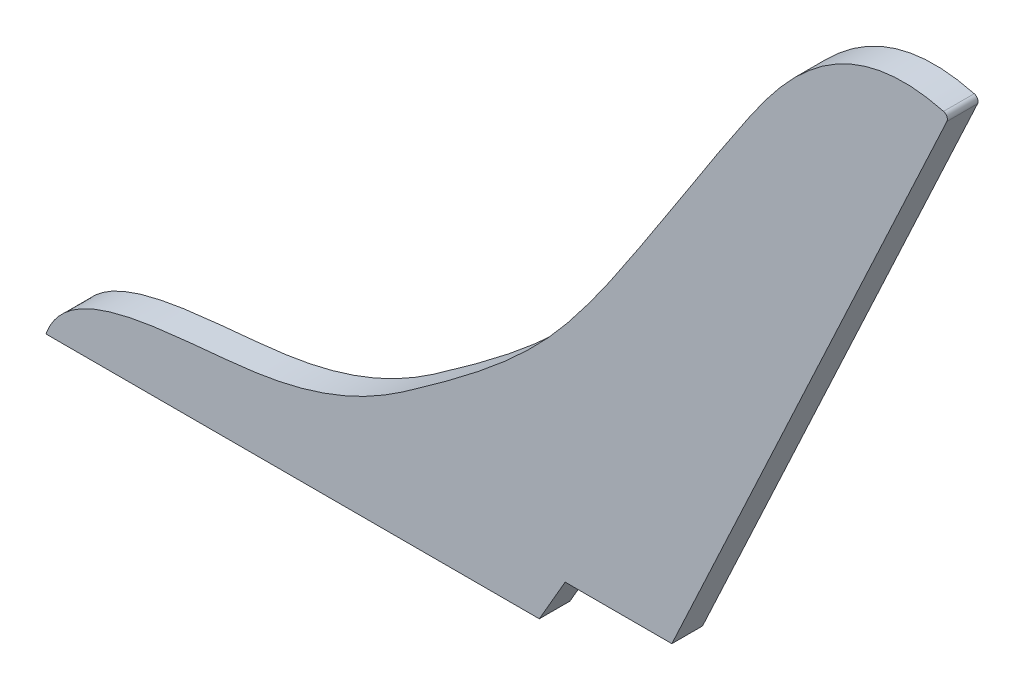
ISO-10303-21;
HEADER;
FILE_DESCRIPTION(('STEP AP214'),'2;1');
FILE_NAME('part.step','',(''),(''),'','','');
FILE_SCHEMA(('AUTOMOTIVE_DESIGN { 1 0 10303 214 1 1 1 1 }'));
ENDSEC;
DATA;
#1=APPLICATION_CONTEXT('core data for automotive mechanical design processes');
#2=APPLICATION_PROTOCOL_DEFINITION('international standard','automotive_design',2000,#1);
#3=PRODUCT_CONTEXT('',#1,'mechanical');
#4=PRODUCT('Part','Part','',(#3));
#5=PRODUCT_RELATED_PRODUCT_CATEGORY('part','',(#4));
#6=PRODUCT_DEFINITION_FORMATION('','',#4);
#7=PRODUCT_DEFINITION_CONTEXT('part definition',#1,'design');
#8=PRODUCT_DEFINITION('design','',#6,#7);
#9=PRODUCT_DEFINITION_SHAPE('','',#8);
#10=(LENGTH_UNIT() NAMED_UNIT(*) SI_UNIT(.MILLI.,.METRE.));
#11=(NAMED_UNIT(*) PLANE_ANGLE_UNIT() SI_UNIT($,.RADIAN.));
#12=(NAMED_UNIT(*) SI_UNIT($,.STERADIAN.) SOLID_ANGLE_UNIT());
#13=UNCERTAINTY_MEASURE_WITH_UNIT(LENGTH_MEASURE(1.E-05),#10,'distance_accuracy_value','');
#14=(GEOMETRIC_REPRESENTATION_CONTEXT(3) GLOBAL_UNCERTAINTY_ASSIGNED_CONTEXT((#13)) GLOBAL_UNIT_ASSIGNED_CONTEXT((#10,
#11,#12)) REPRESENTATION_CONTEXT('',''));
#15=CARTESIAN_POINT('',(0.,0.,0.));
#16=DIRECTION('',(0.,0.,1.));
#17=DIRECTION('',(1.,0.,0.));
#18=AXIS2_PLACEMENT_3D('',#15,#16,#17);
#19=CARTESIAN_POINT('',(4493.36101062911,3182.874,152.4));
#20=CARTESIAN_POINT('',(3948.74780498071,3347.08871829362,152.4));
#21=CARTESIAN_POINT('',(3278.55502622221,2366.31784345516,152.4));
#22=CARTESIAN_POINT('',(3207.90447721529,2236.56738436679,152.4));
#23=CARTESIAN_POINT('',(2889.33328263763,1753.36927298413,152.4));
#24=CARTESIAN_POINT('',(2745.92431891337,1535.79239461075,152.4));
#25=CARTESIAN_POINT('',(2399.47642415647,1097.38893033044,152.4));
#26=CARTESIAN_POINT('',(2074.66626780361,847.032915733597,152.4));
#27=CARTESIAN_POINT('',(1615.60580180907,525.977034043957,152.4));
#28=CARTESIAN_POINT('',(1063.47995918112,273.483968866121,152.4));
#29=CARTESIAN_POINT('',(116.998830003192,333.573371339087,152.4));
#30=CARTESIAN_POINT('',(0.,0.,152.4));
#31=B_SPLINE_CURVE_WITH_KNOTS('',3,(#19,#20,#21,#22,#23,#24,#25,#26,#27,#28,#29,#30),
.UNSPECIFIED.,.F.,.F.,(4,1,1,1,1,1,1,1,1,4),(0.,0.157362959899275,0.346240037201365,
0.38491115038911,0.50540297858898,0.545084918816733,0.74204861243889,0.776786496720836,
0.867843299933418,1.),.UNSPECIFIED.);
#32=DIRECTION('',(0.,0.,-1.));
#33=VECTOR('',#32,1.);
#34=SURFACE_OF_LINEAR_EXTRUSION('',#31,#33);
#35=CARTESIAN_POINT('',(4464.26813879781,3191.13107069706,152.4));
#36=VERTEX_POINT('',#35);
#37=CARTESIAN_POINT('',(0.,0.,152.4));
#38=VERTEX_POINT('',#37);
#39=EDGE_CURVE('E85',#36,#38,#31,.T.);
#40=ORIENTED_EDGE('',*,*,#39,.F.);
#41=DIRECTION('',(0.,0.,-1.));
#42=VECTOR('',#41,1.);
#43=CARTESIAN_POINT('',(4464.26813879781,3191.13107069706,152.4));
#44=LINE('',#43,#42);
#45=CARTESIAN_POINT('',(4464.26813879781,3191.13107069706,0.));
#46=VERTEX_POINT('',#45);
#47=EDGE_CURVE('E108',#36,#46,#44,.T.);
#48=ORIENTED_EDGE('',*,*,#47,.T.);
#49=CARTESIAN_POINT('',(4493.36101062911,3182.874,0.));
#50=CARTESIAN_POINT('',(3948.74780498071,3347.08871829362,0.));
#51=CARTESIAN_POINT('',(3278.55502622221,2366.31784345516,0.));
#52=CARTESIAN_POINT('',(3207.90447721529,2236.56738436679,0.));
#53=CARTESIAN_POINT('',(2889.33328263763,1753.36927298413,0.));
#54=CARTESIAN_POINT('',(2745.92431891337,1535.79239461075,0.));
#55=CARTESIAN_POINT('',(2399.47642415647,1097.38893033044,0.));
#56=CARTESIAN_POINT('',(2074.66626780361,847.032915733597,0.));
#57=CARTESIAN_POINT('',(1615.60580180907,525.977034043957,0.));
#58=CARTESIAN_POINT('',(1063.47995918112,273.483968866121,0.));
#59=CARTESIAN_POINT('',(116.998830003192,333.573371339087,0.));
#60=CARTESIAN_POINT('',(0.,0.,0.));
#61=B_SPLINE_CURVE_WITH_KNOTS('',3,(#49,#50,#51,#52,#53,#54,#55,#56,#57,#58,#59,#60),
.UNSPECIFIED.,.F.,.F.,(4,1,1,1,1,1,1,1,1,4),(0.,0.157362959899275,0.346240037201365,
0.38491115038911,0.50540297858898,0.545084918816733,0.74204861243889,0.776786496720836,
0.867843299933418,1.),.UNSPECIFIED.);
#62=CARTESIAN_POINT('',(0.,0.,0.));
#63=VERTEX_POINT('',#62);
#64=EDGE_CURVE('E106',#46,#63,#61,.T.);
#65=ORIENTED_EDGE('',*,*,#64,.T.);
#66=DIRECTION('',(0.,0.,-1.));
#67=VECTOR('',#66,1.);
#68=CARTESIAN_POINT('',(0.,0.,152.4));
#69=LINE('',#68,#67);
#70=EDGE_CURVE('E100',#38,#63,#69,.T.);
#71=ORIENTED_EDGE('',*,*,#70,.F.);
#72=EDGE_LOOP('',(#40,#48,#65,#71));
#73=FACE_BOUND('',#72,.T.);
#74=ADVANCED_FACE('F33',(#73),#34,.F.);
#75=CARTESIAN_POINT('',(0.,0.,152.4));
#76=DIRECTION('',(0.,1.,0.));
#77=DIRECTION('',(0.,0.,1.));
#78=AXIS2_PLACEMENT_3D('',#75,#76,#77);
#79=PLANE('',#78);
#80=DIRECTION('',(1.,0.,0.));
#81=VECTOR('',#80,1.);
#82=CARTESIAN_POINT('',(0.,0.,0.));
#83=LINE('',#82,#81);
#84=CARTESIAN_POINT('',(2453.64,0.,0.));
#85=VERTEX_POINT('',#84);
#86=EDGE_CURVE('E126',#63,#85,#83,.T.);
#87=ORIENTED_EDGE('',*,*,#86,.T.);
#88=DIRECTION('',(0.,0.,-1.));
#89=VECTOR('',#88,1.);
#90=CARTESIAN_POINT('',(2453.64,0.,152.4));
#91=LINE('',#90,#89);
#92=CARTESIAN_POINT('',(2453.64,0.,152.4));
#93=VERTEX_POINT('',#92);
#94=EDGE_CURVE('E102',#93,#85,#91,.T.);
#95=ORIENTED_EDGE('',*,*,#94,.F.);
#96=DIRECTION('',(1.,0.,0.));
#97=VECTOR('',#96,1.);
#98=CARTESIAN_POINT('',(0.,0.,152.4));
#99=LINE('',#98,#97);
#100=EDGE_CURVE('E88',#38,#93,#99,.T.);
#101=ORIENTED_EDGE('',*,*,#100,.F.);
#102=ORIENTED_EDGE('',*,*,#70,.T.);
#103=EDGE_LOOP('',(#87,#95,#101,#102));
#104=FACE_BOUND('',#103,.T.);
#105=ADVANCED_FACE('F99',(#104),#79,.F.);
#106=CARTESIAN_POINT('',(2453.64,0.,152.4));
#107=DIRECTION('',(-0.86602540378444,0.499999999999997,0.));
#108=DIRECTION('',(-0.499999999999997,-0.86602540378444,0.));
#109=AXIS2_PLACEMENT_3D('',#106,#107,#108);
#110=PLANE('',#109);
#111=DIRECTION('',(0.499999999999997,0.86602540378444,0.));
#112=VECTOR('',#111,1.);
#113=CARTESIAN_POINT('',(2453.64,0.,0.));
#114=LINE('',#113,#112);
#115=CARTESIAN_POINT('',(2582.10274429577,222.504,0.));
#116=VERTEX_POINT('',#115);
#117=EDGE_CURVE('E124',#85,#116,#114,.T.);
#118=ORIENTED_EDGE('',*,*,#117,.T.);
#119=DIRECTION('',(0.,0.,-1.));
#120=VECTOR('',#119,1.);
#121=CARTESIAN_POINT('',(2582.10274429577,222.504,152.4));
#122=LINE('',#121,#120);
#123=CARTESIAN_POINT('',(2582.10274429577,222.504,152.4));
#124=VERTEX_POINT('',#123);
#125=EDGE_CURVE('E111',#124,#116,#122,.T.);
#126=ORIENTED_EDGE('',*,*,#125,.F.);
#127=DIRECTION('',(0.499999999999997,0.86602540378444,0.));
#128=VECTOR('',#127,1.);
#129=CARTESIAN_POINT('',(2453.64,0.,152.4));
#130=LINE('',#129,#128);
#131=EDGE_CURVE('E104',#93,#124,#130,.T.);
#132=ORIENTED_EDGE('',*,*,#131,.F.);
#133=ORIENTED_EDGE('',*,*,#94,.T.);
#134=EDGE_LOOP('',(#118,#126,#132,#133));
#135=FACE_BOUND('',#134,.T.);
#136=ADVANCED_FACE('F147',(#135),#110,.F.);
#137=CARTESIAN_POINT('',(2582.10274429577,222.504,152.4));
#138=DIRECTION('',(0.,1.,0.));
#139=DIRECTION('',(0.,0.,1.));
#140=AXIS2_PLACEMENT_3D('',#137,#138,#139);
#141=PLANE('',#140);
#142=DIRECTION('',(1.,0.,0.));
#143=VECTOR('',#142,1.);
#144=CARTESIAN_POINT('',(2582.10274429577,222.504,0.));
#145=LINE('',#144,#143);
#146=CARTESIAN_POINT('',(3112.9178086568,222.504,0.));
#147=VERTEX_POINT('',#146);
#148=EDGE_CURVE('E122',#116,#147,#145,.T.);
#149=ORIENTED_EDGE('',*,*,#148,.T.);
#150=DIRECTION('',(0.,0.,-1.));
#151=VECTOR('',#150,1.);
#152=CARTESIAN_POINT('',(3112.9178086568,222.504,152.4));
#153=LINE('',#152,#151);
#154=CARTESIAN_POINT('',(3112.9178086568,222.504,152.4));
#155=VERTEX_POINT('',#154);
#156=EDGE_CURVE('E117',#155,#147,#153,.T.);
#157=ORIENTED_EDGE('',*,*,#156,.F.);
#158=DIRECTION('',(1.,0.,0.));
#159=VECTOR('',#158,1.);
#160=CARTESIAN_POINT('',(2582.10274429577,222.504,152.4));
#161=LINE('',#160,#159);
#162=EDGE_CURVE('E135',#124,#155,#161,.T.);
#163=ORIENTED_EDGE('',*,*,#162,.F.);
#164=ORIENTED_EDGE('',*,*,#125,.T.);
#165=EDGE_LOOP('',(#149,#157,#163,#164));
#166=FACE_BOUND('',#165,.T.);
#167=ADVANCED_FACE('F150',(#166),#141,.F.);
#168=CARTESIAN_POINT('',(3112.9178086568,222.504,152.4));
#169=DIRECTION('',(-0.906307787036651,0.422618261740697,0.));
#170=DIRECTION('',(-0.422618261740697,-0.906307787036651,0.));
#171=AXIS2_PLACEMENT_3D('',#168,#169,#170);
#172=PLANE('',#171);
#173=DIRECTION('',(0.422618261740697,0.906307787036651,0.));
#174=VECTOR('',#173,1.);
#175=CARTESIAN_POINT('',(3112.9178086568,222.504,0.));
#176=LINE('',#175,#174);
#177=CARTESIAN_POINT('',(4480.75951035849,3155.84999546088,0.));
#178=VERTEX_POINT('',#177);
#179=EDGE_CURVE('E95',#147,#178,#176,.T.);
#180=ORIENTED_EDGE('',*,*,#179,.T.);
#181=DIRECTION('',(0.,0.,-1.));
#182=VECTOR('',#181,1.);
#183=CARTESIAN_POINT('',(4480.75951035849,3155.84999546088,152.4));
#184=LINE('',#183,#182);
#185=CARTESIAN_POINT('',(4480.75951035849,3155.84999546088,152.4));
#186=VERTEX_POINT('',#185);
#187=EDGE_CURVE('E41',#178,#186,#184,.F.);
#188=ORIENTED_EDGE('',*,*,#187,.T.);
#189=DIRECTION('',(0.422618261740697,0.906307787036651,0.));
#190=VECTOR('',#189,1.);
#191=CARTESIAN_POINT('',(3112.9178086568,222.504,152.4));
#192=LINE('',#191,#190);
#193=EDGE_CURVE('E120',#155,#186,#192,.T.);
#194=ORIENTED_EDGE('',*,*,#193,.F.);
#195=ORIENTED_EDGE('',*,*,#156,.T.);
#196=EDGE_LOOP('',(#180,#188,#194,#195));
#197=FACE_BOUND('',#196,.T.);
#198=ADVANCED_FACE('F154',(#197),#172,.F.);
#199=CARTESIAN_POINT('',(2679.67867915708,1454.57585043453,152.4));
#200=DIRECTION('',(0.,0.,1.));
#201=DIRECTION('',(1.,0.,0.));
#202=AXIS2_PLACEMENT_3D('',#199,#200,#201);
#203=PLANE('',#202);
#204=ORIENTED_EDGE('',*,*,#193,.T.);
#205=CARTESIAN_POINT('',(4457.73929256777,3166.5844993091,152.4));
#206=DIRECTION('',(0.,0.,1.));
#207=DIRECTION('',(1.,0.,0.));
#208=AXIS2_PLACEMENT_3D('',#205,#206,#207);
#209=CIRCLE('',#208,25.4);
#210=EDGE_CURVE('E11',#186,#36,#209,.T.);
#211=ORIENTED_EDGE('',*,*,#210,.T.);
#212=ORIENTED_EDGE('',*,*,#39,.T.);
#213=ORIENTED_EDGE('',*,*,#100,.T.);
#214=ORIENTED_EDGE('',*,*,#131,.T.);
#215=ORIENTED_EDGE('',*,*,#162,.T.);
#216=EDGE_LOOP('',(#204,#211,#212,#213,#214,#215));
#217=FACE_BOUND('',#216,.T.);
#218=ADVANCED_FACE('F87',(#217),#203,.T.);
#219=CARTESIAN_POINT('',(2679.67867915708,1454.57585043453,0.));
#220=DIRECTION('',(0.,0.,1.));
#221=DIRECTION('',(1.,0.,0.));
#222=AXIS2_PLACEMENT_3D('',#219,#220,#221);
#223=PLANE('',#222);
#224=ORIENTED_EDGE('',*,*,#64,.F.);
#225=CARTESIAN_POINT('',(4457.73929256777,3166.5844993091,0.));
#226=DIRECTION('',(0.,0.,1.));
#227=DIRECTION('',(1.,0.,0.));
#228=AXIS2_PLACEMENT_3D('',#225,#226,#227);
#229=CIRCLE('',#228,25.4);
#230=EDGE_CURVE('E55',#46,#178,#229,.F.);
#231=ORIENTED_EDGE('',*,*,#230,.T.);
#232=ORIENTED_EDGE('',*,*,#179,.F.);
#233=ORIENTED_EDGE('',*,*,#148,.F.);
#234=ORIENTED_EDGE('',*,*,#117,.F.);
#235=ORIENTED_EDGE('',*,*,#86,.F.);
#236=EDGE_LOOP('',(#224,#231,#232,#233,#234,#235));
#237=FACE_BOUND('',#236,.T.);
#238=ADVANCED_FACE('F158',(#237),#223,.F.);
#239=CARTESIAN_POINT('',(4457.73929256777,3166.5844993091,76.2));
#240=DIRECTION('',(0.,0.,-1.));
#241=DIRECTION('',(-1.,0.,0.));
#242=AXIS2_PLACEMENT_3D('',#239,#240,#241);
#243=CYLINDRICAL_SURFACE('',#242,25.4);
#244=ORIENTED_EDGE('',*,*,#210,.F.);
#245=ORIENTED_EDGE('',*,*,#187,.F.);
#246=ORIENTED_EDGE('',*,*,#230,.F.);
#247=ORIENTED_EDGE('',*,*,#47,.F.);
#248=EDGE_LOOP('',(#244,#245,#246,#247));
#249=FACE_BOUND('',#248,.T.);
#250=ADVANCED_FACE('F35',(#249),#243,.T.);
#251=CLOSED_SHELL('',(#74,#105,#136,#167,#198,#218,#238,#250));
#252=MANIFOLD_SOLID_BREP('B2',#251);
#253=ADVANCED_BREP_SHAPE_REPRESENTATION('',(#18,#252),#14);
#254=SHAPE_DEFINITION_REPRESENTATION(#9,#253);
ENDSEC;
END-ISO-10303-21;
